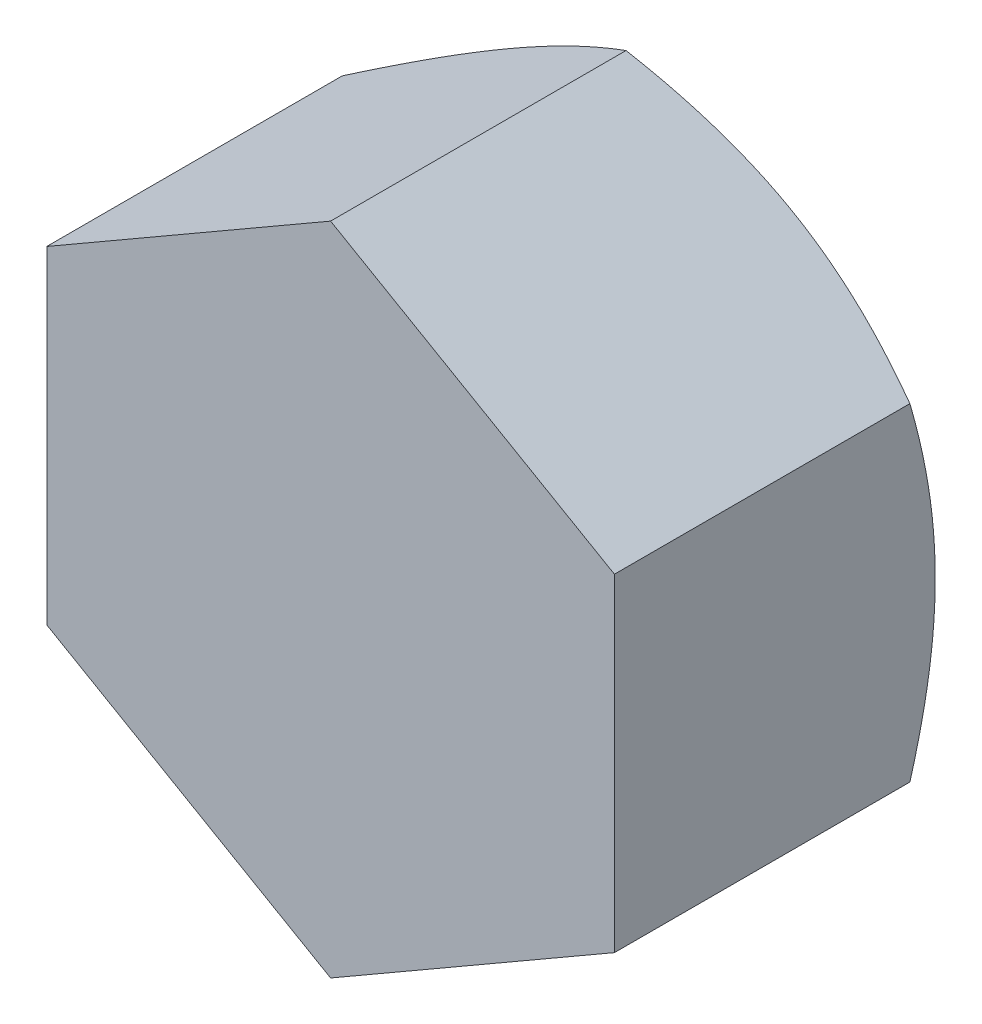
ISO-10303-21;
HEADER;
FILE_DESCRIPTION(('STEP AP214'),'2;1');
FILE_NAME('part.step','',(''),(''),'','','');
FILE_SCHEMA(('AUTOMOTIVE_DESIGN { 1 0 10303 214 1 1 1 1 }'));
ENDSEC;
DATA;
#1=APPLICATION_CONTEXT('core data for automotive mechanical design processes');
#2=APPLICATION_PROTOCOL_DEFINITION('international standard','automotive_design',2000,#1);
#3=PRODUCT_CONTEXT('',#1,'mechanical');
#4=PRODUCT('Part','Part','',(#3));
#5=PRODUCT_RELATED_PRODUCT_CATEGORY('part','',(#4));
#6=PRODUCT_DEFINITION_FORMATION('','',#4);
#7=PRODUCT_DEFINITION_CONTEXT('part definition',#1,'design');
#8=PRODUCT_DEFINITION('design','',#6,#7);
#9=PRODUCT_DEFINITION_SHAPE('','',#8);
#10=(LENGTH_UNIT() NAMED_UNIT(*) SI_UNIT(.MILLI.,.METRE.));
#11=(NAMED_UNIT(*) PLANE_ANGLE_UNIT() SI_UNIT($,.RADIAN.));
#12=(NAMED_UNIT(*) SI_UNIT($,.STERADIAN.) SOLID_ANGLE_UNIT());
#13=UNCERTAINTY_MEASURE_WITH_UNIT(LENGTH_MEASURE(1.E-05),#10,'distance_accuracy_value','');
#14=(GEOMETRIC_REPRESENTATION_CONTEXT(3) GLOBAL_UNCERTAINTY_ASSIGNED_CONTEXT((#13)) GLOBAL_UNIT_ASSIGNED_CONTEXT((#10,
#11,#12)) REPRESENTATION_CONTEXT('',''));
#15=CARTESIAN_POINT('',(0.,0.,0.));
#16=DIRECTION('',(0.,0.,1.));
#17=DIRECTION('',(1.,0.,0.));
#18=AXIS2_PLACEMENT_3D('',#15,#16,#17);
#19=CARTESIAN_POINT('',(0.,-28.8675134594813,30.));
#20=DIRECTION('',(-0.500000000000001,0.866025403784438,0.));
#21=DIRECTION('',(-0.866025403784438,-0.500000000000001,0.));
#22=AXIS2_PLACEMENT_3D('',#19,#20,#21);
#23=PLANE('',#22);
#24=DIRECTION('',(0.,0.,-1.));
#25=VECTOR('',#24,1.);
#26=CARTESIAN_POINT('',(0.,-28.8675134594813,30.));
#27=LINE('',#26,#25);
#28=CARTESIAN_POINT('',(0.,-28.8675134594813,30.));
#29=VERTEX_POINT('',#28);
#30=CARTESIAN_POINT('',(0.,-28.8675134594813,3.97632477146253));
#31=VERTEX_POINT('',#30);
#32=EDGE_CURVE('E120',#29,#31,#27,.T.);
#33=ORIENTED_EDGE('',*,*,#32,.T.);
#34=CARTESIAN_POINT('',(-0.000199999999998299,-28.8676289295351,3.97639143852919));
#35=CARTESIAN_POINT('',(0.549289052084762,-28.5503812773973,3.79324187699658));
#36=CARTESIAN_POINT('',(1.10092140397883,-28.2318961905375,3.61840342685477));
#37=CARTESIAN_POINT('',(2.20860953613433,-27.5923721492594,3.28765893053867));
#38=CARTESIAN_POINT('',(2.76466670754444,-27.2713323916609,3.13175911117848));
#39=CARTESIAN_POINT('',(3.88229099509689,-26.6260717083897,2.84098441971019));
#40=CARTESIAN_POINT('',(4.44386798066448,-26.3018450846015,2.70615975622985));
#41=CARTESIAN_POINT('',(5.57090024785688,-25.6511527017526,2.46043981125035));
#42=CARTESIAN_POINT('',(6.13635513733568,-25.3246871690974,2.34954214594442));
#43=CARTESIAN_POINT('',(7.25668973319835,-24.6778616885936,2.15638363698066));
#44=CARTESIAN_POINT('',(7.81148633888982,-24.3575497189522,2.07348401743573));
#45=CARTESIAN_POINT('',(8.92362166302868,-23.7154580901853,1.9344803387716));
#46=CARTESIAN_POINT('',(9.48096043020087,-23.3936784029286,1.8783767954414));
#47=CARTESIAN_POINT('',(10.5965741804021,-22.7495785039383,1.794381855324));
#48=CARTESIAN_POINT('',(11.1548472575887,-22.4272593925433,1.7664569345372));
#49=CARTESIAN_POINT('',(12.2719085883985,-21.7823237324989,1.73941975769827));
#50=CARTESIAN_POINT('',(12.8306968255687,-21.4597071933487,1.74030661129885));
#51=CARTESIAN_POINT('',(13.8753595301573,-20.8565708996421,1.76888055940881));
#52=CARTESIAN_POINT('',(14.3613084014292,-20.5760081880009,1.79308331308031));
#53=CARTESIAN_POINT('',(15.3320460032293,-20.0155525722891,1.86281959190132));
#54=CARTESIAN_POINT('',(15.8168347502745,-19.7356596586825,1.90835281152515));
#55=CARTESIAN_POINT('',(16.7850729894121,-19.1766470506767,2.01996088693692));
#56=CARTESIAN_POINT('',(17.2685208700197,-18.8975282866688,2.08605431780327));
#57=CARTESIAN_POINT('',(18.2331018020561,-18.3406272259024,2.23761307883569));
#58=CARTESIAN_POINT('',(18.7142348632835,-18.0628449234867,2.32307832692708));
#59=CARTESIAN_POINT('',(20.1748523165797,-17.219557043643,2.61072512631684));
#60=CARTESIAN_POINT('',(21.1501868444223,-16.6564473914432,2.84160387085608));
#61=CARTESIAN_POINT('',(22.6024175587137,-15.8180015976216,3.23466403779096));
#62=CARTESIAN_POINT('',(23.0842831517092,-15.5397963677924,3.37333299462311));
#63=CARTESIAN_POINT('',(24.044681348808,-14.9853102101682,3.6647094192832));
#64=CARTESIAN_POINT('',(24.5232148516457,-14.7090287634886,3.81741293035811));
#65=CARTESIAN_POINT('',(25.0002,-14.4336412596868,3.97639143852919));
#66=B_SPLINE_CURVE_WITH_KNOTS('',3,(#34,#35,#36,#37,#38,#39,#40,#41,#42,#43,#44,#45,#46,#47,#48,
#49,#50,#51,#52,#53,#54,#55,#56,#57,#58,#59,#60,#61,#62,#63,#64,#65),.UNSPECIFIED.,.F.,.F.,(4,2,
2,2,2,2,2,2,2,2,2,2,2,2,2,4),(0.,1.98125159104182,3.9631528428522,5.94970601011487,
7.93606116892722,9.87343019740899,11.8108365161782,13.7459351828953,15.6809740508569,
17.3655086515647,19.0500191246778,20.7360559068297,22.4220855456996,25.8684114168824,
27.588572489712,29.3082500776185),.UNSPECIFIED.);
#67=CARTESIAN_POINT('',(25.,-14.4337567297406,3.97632477146252));
#68=VERTEX_POINT('',#67);
#69=EDGE_CURVE('E61',#31,#68,#66,.T.);
#70=ORIENTED_EDGE('',*,*,#69,.T.);
#71=DIRECTION('',(0.,0.,-1.));
#72=VECTOR('',#71,1.);
#73=CARTESIAN_POINT('',(25.,-14.4337567297406,30.));
#74=LINE('',#73,#72);
#75=CARTESIAN_POINT('',(25.,-14.4337567297406,30.));
#76=VERTEX_POINT('',#75);
#77=EDGE_CURVE('E12',#76,#68,#74,.T.);
#78=ORIENTED_EDGE('',*,*,#77,.F.);
#79=DIRECTION('',(0.866025403784438,0.500000000000001,0.));
#80=VECTOR('',#79,1.);
#81=CARTESIAN_POINT('',(0.,-28.8675134594813,30.));
#82=LINE('',#81,#80);
#83=EDGE_CURVE('E152',#29,#76,#82,.T.);
#84=ORIENTED_EDGE('',*,*,#83,.F.);
#85=EDGE_LOOP('',(#33,#70,#78,#84));
#86=FACE_BOUND('',#85,.T.);
#87=ADVANCED_FACE('F44',(#86),#23,.F.);
#88=CARTESIAN_POINT('',(25.,-14.4337567297406,30.));
#89=DIRECTION('',(-1.,0.,0.));
#90=DIRECTION('',(0.,-1.,0.));
#91=AXIS2_PLACEMENT_3D('',#88,#89,#90);
#92=PLANE('',#91);
#93=ORIENTED_EDGE('',*,*,#77,.T.);
#94=CARTESIAN_POINT('',(25.,-43.5772807222665,16.3152862663971));
#95=CARTESIAN_POINT('',(25.,-43.0563685832066,16.0544210887609));
#96=CARTESIAN_POINT('',(25.,-42.5349954534363,15.7944768699678));
#97=CARTESIAN_POINT('',(25.,-41.4912415217681,15.2766137440135));
#98=CARTESIAN_POINT('',(25.,-40.9688607153084,15.0186948460477));
#99=CARTESIAN_POINT('',(25.,-39.4000205562734,14.2482229505251));
#100=CARTESIAN_POINT('',(25.,-38.3519279785103,13.7389871153385));
#101=CARTESIAN_POINT('',(25.,-36.2485085721749,12.7301929059742));
#102=CARTESIAN_POINT('',(25.,-35.1931714639728,12.2306559371404));
#103=CARTESIAN_POINT('',(25.,-33.076402903503,11.2446895295247));
#104=CARTESIAN_POINT('',(25.,-32.0149715701925,10.7582598359409));
#105=CARTESIAN_POINT('',(25.,-29.8366475594791,9.77990453187292));
#106=CARTESIAN_POINT('',(25.,-28.7194184767459,9.28872610629576));
#107=CARTESIAN_POINT('',(25.,-26.4753657408613,8.32851332741492));
#108=CARTESIAN_POINT('',(25.,-25.3485416626338,7.85947996126683));
#109=CARTESIAN_POINT('',(25.,-23.6501353206705,7.1772558183669));
#110=CARTESIAN_POINT('',(25.,-23.0828055460957,6.95346452143932));
#111=CARTESIAN_POINT('',(25.,-21.9450588595626,6.5138828392078));
#112=CARTESIAN_POINT('',(25.,-21.3746420001405,6.29809231823396));
#113=CARTESIAN_POINT('',(25.,-20.2305026548156,5.87557588818955));
#114=CARTESIAN_POINT('',(25.,-19.6567804188915,5.66884930355547));
#115=CARTESIAN_POINT('',(25.,-18.5057514380286,5.2656558207293));
#116=CARTESIAN_POINT('',(25.,-17.9284447734862,5.06918869334772));
#117=CARTESIAN_POINT('',(25.,-16.6355982782216,4.64362566721425));
#118=CARTESIAN_POINT('',(25.,-15.9190634092029,4.41753548937372));
#119=CARTESIAN_POINT('',(25.,-14.4798656651029,3.98587406236213));
#120=CARTESIAN_POINT('',(25.,-13.7572032124323,3.78030141107441));
#121=CARTESIAN_POINT('',(25.,-12.3054885670565,3.39288759828384));
#122=CARTESIAN_POINT('',(25.,-11.5764362181095,3.21104701880056));
#123=CARTESIAN_POINT('',(25.,-10.112034461392,2.87459913468423));
#124=CARTESIAN_POINT('',(25.,-9.37668508888708,2.71999167764019));
#125=CARTESIAN_POINT('',(25.,-7.91268916007062,2.44394934835832));
#126=CARTESIAN_POINT('',(25.,-7.18414126795437,2.32199507716184));
#127=CARTESIAN_POINT('',(25.,-5.72225840949767,2.11104924900467));
#128=CARTESIAN_POINT('',(25.,-4.98892352341115,2.02205714087051));
#129=CARTESIAN_POINT('',(25.,-3.51903424239963,1.87970742323896));
#130=CARTESIAN_POINT('',(25.,-2.78248109235317,1.8263370840782));
#131=CARTESIAN_POINT('',(25.,-1.30760523412593,1.75691535752753));
#132=CARTESIAN_POINT('',(25.,-0.569282537936912,1.74086371795046));
#133=CARTESIAN_POINT('',(25.,0.911819512644196,1.74664323567713));
#134=CARTESIAN_POINT('',(25.,1.65459794331451,1.768711284555));
#135=CARTESIAN_POINT('',(25.,3.13807045816364,1.85043061648652));
#136=CARTESIAN_POINT('',(25.,3.87876451915421,1.91008231600438));
#137=CARTESIAN_POINT('',(25.,5.35666308052783,2.06505740706202));
#138=CARTESIAN_POINT('',(25.,6.09386612840581,2.16039451664693));
#139=CARTESIAN_POINT('',(25.,7.56324162943187,2.38392011846666));
#140=CARTESIAN_POINT('',(25.,8.29541400308831,2.51210912858694));
#141=CARTESIAN_POINT('',(25.,9.76656769738784,2.80050187508001));
#142=CARTESIAN_POINT('',(25.,10.5054470304733,2.96122206746965));
#143=CARTESIAN_POINT('',(25.,11.9767903987303,3.30958699696976));
#144=CARTESIAN_POINT('',(25.,12.7092544000909,3.49723187589139));
#145=CARTESIAN_POINT('',(25.,14.1677140488721,3.89591247452221));
#146=CARTESIAN_POINT('',(25.,14.8937100018829,4.10694708275734));
#147=CARTESIAN_POINT('',(25.,16.3395540822867,4.54919616922907));
#148=CARTESIAN_POINT('',(25.,17.0594018053171,4.78041196371009));
#149=CARTESIAN_POINT('',(25.,18.3453860604897,5.21066532261206));
#150=CARTESIAN_POINT('',(25.,18.9125994331202,5.40650198242793));
#151=CARTESIAN_POINT('',(25.,20.0436051762973,5.80783154544797));
#152=CARTESIAN_POINT('',(25.,20.6073974792064,6.01332463887042));
#153=CARTESIAN_POINT('',(25.,22.2940718141099,6.64259926471909));
#154=CARTESIAN_POINT('',(25.,23.4121944587021,7.07915688498004));
#155=CARTESIAN_POINT('',(25.,25.6381923365789,7.97916873115717));
#156=CARTESIAN_POINT('',(25.,26.7460615749784,8.44263766549797));
#157=CARTESIAN_POINT('',(25.,28.9526582810025,9.39067085207376));
#158=CARTESIAN_POINT('',(25.,30.0513861086696,9.87523426875438));
#159=CARTESIAN_POINT('',(25.,32.1944539716365,10.8401545021526));
#160=CARTESIAN_POINT('',(25.,33.2391123123234,11.3198067307284));
#161=CARTESIAN_POINT('',(25.,35.3225683437274,12.2916995175831));
#162=CARTESIAN_POINT('',(25.,36.361365929678,12.7839403000295));
#163=CARTESIAN_POINT('',(25.,38.4321105016929,13.7778572882132));
#164=CARTESIAN_POINT('',(25.,39.464066501214,14.2795147410884));
#165=CARTESIAN_POINT('',(25.,41.0088115297687,15.0384015658447));
#166=CARTESIAN_POINT('',(25.,41.5231802591306,15.2924231984288));
#167=CARTESIAN_POINT('',(25.,42.5509419268147,15.8024276001523));
#168=CARTESIAN_POINT('',(25.,43.0643348693274,16.0584103608456));
#169=CARTESIAN_POINT('',(25.,43.5772807222665,16.3152862663971));
#170=B_SPLINE_CURVE_WITH_KNOTS('',3,(#94,#95,#96,#97,#98,#99,#100,#101,#102,#103,#104,#105,#106,
#107,#108,#109,#110,#111,#112,#113,#114,#115,#116,#117,#118,#119,#120,#121,#122,#123,#124,#125,
#126,#127,#128,#129,#130,#131,#132,#133,#134,#135,#136,#137,#138,#139,#140,#141,#142,#143,#144,
#145,#146,#147,#148,#149,#150,#151,#152,#153,#154,#155,#156,#157,#158,#159,#160,#161,#162,#163,
#164,#165,#166,#167,#168,#169),.UNSPECIFIED.,.F.,.F.,(4,2,2,2,2,2,2,2,2,2,2,2,2,2,2,2,2,2,2,2,2,
2,2,2,2,2,2,2,2,2,2,2,2,2,2,2,2,4),(0.,1.74773992342995,3.49548777741172,6.99120001058636,
10.4939076901573,13.9965472288587,17.6576702915162,21.3189564014892,23.1485279376223,
24.9780684353395,26.8074723390732,28.6368353576361,30.8906402614217,33.1442910401839,
35.3979970784483,37.6516905033783,39.8670593067691,42.0823910644223,44.2969307348576,
46.5114554401389,48.7397916800244,50.9681526125253,53.1973710440037,55.4266246195947,
57.6945224530806,59.9624322319243,62.2302342864351,64.4981843607649,66.298299352136,
68.0984498181395,71.6989306336591,75.3013981675158,78.9037231369097,82.3521600153743,
85.8006583438356,89.2428957988782,90.9639152835414,92.6849273601793),.UNSPECIFIED.);
#171=CARTESIAN_POINT('',(25.,14.4337567297407,3.97632477146253));
#172=VERTEX_POINT('',#171);
#173=EDGE_CURVE('E146',#68,#172,#170,.T.);
#174=ORIENTED_EDGE('',*,*,#173,.T.);
#175=DIRECTION('',(0.,0.,-1.));
#176=VECTOR('',#175,1.);
#177=CARTESIAN_POINT('',(25.,14.4337567297407,30.));
#178=LINE('',#177,#176);
#179=CARTESIAN_POINT('',(25.,14.4337567297407,30.));
#180=VERTEX_POINT('',#179);
#181=EDGE_CURVE('E54',#180,#172,#178,.T.);
#182=ORIENTED_EDGE('',*,*,#181,.F.);
#183=DIRECTION('',(0.,1.,0.));
#184=VECTOR('',#183,1.);
#185=CARTESIAN_POINT('',(25.,-14.4337567297406,30.));
#186=LINE('',#185,#184);
#187=EDGE_CURVE('E145',#76,#180,#186,.T.);
#188=ORIENTED_EDGE('',*,*,#187,.F.);
#189=EDGE_LOOP('',(#93,#174,#182,#188));
#190=FACE_BOUND('',#189,.T.);
#191=ADVANCED_FACE('F144',(#190),#92,.F.);
#192=CARTESIAN_POINT('',(25.,14.4337567297407,30.));
#193=DIRECTION('',(-0.5,-0.866025403784439,0.));
#194=DIRECTION('',(0.866025403784439,-0.5,0.));
#195=AXIS2_PLACEMENT_3D('',#192,#193,#194);
#196=PLANE('',#195);
#197=ORIENTED_EDGE('',*,*,#181,.T.);
#198=CARTESIAN_POINT('',(25.0002,14.4336412596868,3.9763914385292));
#199=CARTESIAN_POINT('',(24.4507109479152,14.7508889118247,3.79324187699658));
#200=CARTESIAN_POINT('',(23.8990785960212,15.0693739986845,3.61840342685477));
#201=CARTESIAN_POINT('',(22.7913904638657,15.7088980399626,3.28765893053867));
#202=CARTESIAN_POINT('',(22.2353332924556,16.0299377975611,3.13175911117848));
#203=CARTESIAN_POINT('',(21.1177090049031,16.6751984808323,2.84098441971019));
#204=CARTESIAN_POINT('',(20.5561320193355,16.9994251046205,2.70615975622985));
#205=CARTESIAN_POINT('',(19.4290997521431,17.6501174874694,2.46043981125035));
#206=CARTESIAN_POINT('',(18.8636448626643,17.9765830201246,2.34954214594442));
#207=CARTESIAN_POINT('',(17.7433102668017,18.6234085006283,2.15638363698067));
#208=CARTESIAN_POINT('',(17.1885136611102,18.9437204702698,2.07348401743574));
#209=CARTESIAN_POINT('',(16.0763783369713,19.5858120990367,1.9344803387716));
#210=CARTESIAN_POINT('',(15.5190395697991,19.9075917862933,1.8783767954414));
#211=CARTESIAN_POINT('',(14.4034258195979,20.5516916852837,1.79438185532401));
#212=CARTESIAN_POINT('',(13.8451527424113,20.8740107966786,1.7664569345372));
#213=CARTESIAN_POINT('',(12.7280914116014,21.5189464567231,1.73941975769828));
#214=CARTESIAN_POINT('',(12.1693031744313,21.8415629958732,1.74030661129885));
#215=CARTESIAN_POINT('',(11.1246404698427,22.4446992895798,1.76888055940882));
#216=CARTESIAN_POINT('',(10.6386915985708,22.7252620012211,1.79308331308032));
#217=CARTESIAN_POINT('',(9.66795399677066,23.2857176169329,1.86281959190133));
#218=CARTESIAN_POINT('',(9.18316524972546,23.5656105305395,1.90835281152516));
#219=CARTESIAN_POINT('',(8.21492701058794,24.1246231385452,2.01996088693693));
#220=CARTESIAN_POINT('',(7.73147912998032,24.4037419025532,2.08605431780328));
#221=CARTESIAN_POINT('',(6.76689819794391,24.9606429633196,2.23761307883571));
#222=CARTESIAN_POINT('',(6.28576513671649,25.2384252657353,2.32307832692709));
#223=CARTESIAN_POINT('',(4.82514768342029,26.0817131455789,2.61072512631686));
#224=CARTESIAN_POINT('',(3.84981315557772,26.6448227977788,2.84160387085609));
#225=CARTESIAN_POINT('',(2.3975824412863,27.4832685916003,3.23466403779096));
#226=CARTESIAN_POINT('',(1.91571684829083,27.7614738214295,3.37333299462312));
#227=CARTESIAN_POINT('',(0.955318651191971,28.3159599790538,3.66470941928322));
#228=CARTESIAN_POINT('',(0.476785148354278,28.5922414257333,3.81741293035812));
#229=CARTESIAN_POINT('',(-0.000200000000000546,28.8676289295351,3.9763914385292));
#230=B_SPLINE_CURVE_WITH_KNOTS('',3,(#198,#199,#200,#201,#202,#203,#204,#205,#206,#207,#208,
#209,#210,#211,#212,#213,#214,#215,#216,#217,#218,#219,#220,#221,#222,#223,#224,#225,#226,#227,
#228,#229),.UNSPECIFIED.,.F.,.F.,(4,2,2,2,2,2,2,2,2,2,2,2,2,2,2,4),(0.,1.98125159104182,
3.9631528428522,5.94970601011487,7.93606116892722,9.87343019740899,11.8108365161782,
13.7459351828953,15.6809740508569,17.3655086515647,19.0500191246777,20.7360559068297,
22.4220855456996,25.8684114168823,27.5885724897119,29.3082500776184),.UNSPECIFIED.);
#231=CARTESIAN_POINT('',(0.,28.8675134594813,3.97632477146253));
#232=VERTEX_POINT('',#231);
#233=EDGE_CURVE('E140',#172,#232,#230,.T.);
#234=ORIENTED_EDGE('',*,*,#233,.T.);
#235=DIRECTION('',(0.,0.,-1.));
#236=VECTOR('',#235,1.);
#237=CARTESIAN_POINT('',(0.,28.8675134594813,30.));
#238=LINE('',#237,#236);
#239=CARTESIAN_POINT('',(0.,28.8675134594813,30.));
#240=VERTEX_POINT('',#239);
#241=EDGE_CURVE('E124',#240,#232,#238,.T.);
#242=ORIENTED_EDGE('',*,*,#241,.F.);
#243=DIRECTION('',(-0.866025403784439,0.5,0.));
#244=VECTOR('',#243,1.);
#245=CARTESIAN_POINT('',(25.,14.4337567297407,30.));
#246=LINE('',#245,#244);
#247=EDGE_CURVE('E141',#180,#240,#246,.T.);
#248=ORIENTED_EDGE('',*,*,#247,.F.);
#249=EDGE_LOOP('',(#197,#234,#242,#248));
#250=FACE_BOUND('',#249,.T.);
#251=ADVANCED_FACE('F138',(#250),#196,.F.);
#252=CARTESIAN_POINT('',(0.,28.8675134594813,30.));
#253=DIRECTION('',(0.5,-0.866025403784438,0.));
#254=DIRECTION('',(0.866025403784438,0.5,0.));
#255=AXIS2_PLACEMENT_3D('',#252,#253,#254);
#256=PLANE('',#255);
#257=ORIENTED_EDGE('',*,*,#241,.T.);
#258=CARTESIAN_POINT('',(0.000199999999999174,28.8676289295351,3.9763914385292));
#259=CARTESIAN_POINT('',(-0.549289052084762,28.5503812773973,3.79324187699659));
#260=CARTESIAN_POINT('',(-1.10092140397883,28.2318961905375,3.61840342685477));
#261=CARTESIAN_POINT('',(-2.20860953613432,27.5923721492594,3.28765893053868));
#262=CARTESIAN_POINT('',(-2.76466670754444,27.2713323916609,3.13175911117849));
#263=CARTESIAN_POINT('',(-3.88229099509689,26.6260717083897,2.84098441971019));
#264=CARTESIAN_POINT('',(-4.44386798066448,26.3018450846015,2.70615975622985));
#265=CARTESIAN_POINT('',(-5.57090024785688,25.6511527017526,2.46043981125035));
#266=CARTESIAN_POINT('',(-6.13635513733568,25.3246871690974,2.34954214594442));
#267=CARTESIAN_POINT('',(-7.25668973319835,24.6778616885936,2.15638363698066));
#268=CARTESIAN_POINT('',(-7.81148633888982,24.3575497189522,2.07348401743574));
#269=CARTESIAN_POINT('',(-8.92362166302868,23.7154580901853,1.9344803387716));
#270=CARTESIAN_POINT('',(-9.48096043020088,23.3936784029286,1.8783767954414));
#271=CARTESIAN_POINT('',(-10.5965741804021,22.7495785039383,1.794381855324));
#272=CARTESIAN_POINT('',(-11.1548472575887,22.4272593925433,1.7664569345372));
#273=CARTESIAN_POINT('',(-12.2719085883985,21.7823237324989,1.73941975769828));
#274=CARTESIAN_POINT('',(-12.8306968255687,21.4597071933487,1.74030661129885));
#275=CARTESIAN_POINT('',(-13.8753595301573,20.8565708996422,1.76888055940881));
#276=CARTESIAN_POINT('',(-14.3613084014292,20.5760081880009,1.79308331308032));
#277=CARTESIAN_POINT('',(-15.3320460032293,20.0155525722891,1.86281959190132));
#278=CARTESIAN_POINT('',(-15.8168347502745,19.7356596586825,1.90835281152515));
#279=CARTESIAN_POINT('',(-16.7850729894121,19.1766470506767,2.01996088693693));
#280=CARTESIAN_POINT('',(-17.2685208700197,18.8975282866688,2.08605431780327));
#281=CARTESIAN_POINT('',(-18.2331018020561,18.3406272259024,2.2376130788357));
#282=CARTESIAN_POINT('',(-18.7142348632835,18.0628449234867,2.32307832692709));
#283=CARTESIAN_POINT('',(-20.1748523165797,17.2195570436431,2.61072512631685));
#284=CARTESIAN_POINT('',(-21.1501868444223,16.6564473914432,2.84160387085608));
#285=CARTESIAN_POINT('',(-22.6024175587137,15.8180015976216,3.23466403779096));
#286=CARTESIAN_POINT('',(-23.0842831517092,15.5397963677925,3.37333299462312));
#287=CARTESIAN_POINT('',(-24.044681348808,14.9853102101682,3.66470941928321));
#288=CARTESIAN_POINT('',(-24.5232148516457,14.7090287634886,3.81741293035812));
#289=CARTESIAN_POINT('',(-25.0002,14.4336412596868,3.97639143852919));
#290=B_SPLINE_CURVE_WITH_KNOTS('',3,(#258,#259,#260,#261,#262,#263,#264,#265,#266,#267,#268,
#269,#270,#271,#272,#273,#274,#275,#276,#277,#278,#279,#280,#281,#282,#283,#284,#285,#286,#287,
#288,#289),.UNSPECIFIED.,.F.,.F.,(4,2,2,2,2,2,2,2,2,2,2,2,2,2,2,4),(0.,1.98125159104182,
3.96315284285219,5.94970601011487,7.93606116892722,9.873430197409,11.8108365161782,
13.7459351828953,15.6809740508569,17.3655086515647,19.0500191246777,20.7360559068297,
22.4220855456996,25.8684114168824,27.588572489712,29.3082500776185),.UNSPECIFIED.);
#291=CARTESIAN_POINT('',(-25.,14.4337567297406,3.97632477146253));
#292=VERTEX_POINT('',#291);
#293=EDGE_CURVE('E116',#232,#292,#290,.T.);
#294=ORIENTED_EDGE('',*,*,#293,.T.);
#295=DIRECTION('',(0.,0.,-1.));
#296=VECTOR('',#295,1.);
#297=CARTESIAN_POINT('',(-25.,14.4337567297406,30.));
#298=LINE('',#297,#296);
#299=CARTESIAN_POINT('',(-25.,14.4337567297406,30.));
#300=VERTEX_POINT('',#299);
#301=EDGE_CURVE('E114',#300,#292,#298,.T.);
#302=ORIENTED_EDGE('',*,*,#301,.F.);
#303=DIRECTION('',(-0.866025403784438,-0.5,0.));
#304=VECTOR('',#303,1.);
#305=CARTESIAN_POINT('',(0.,28.8675134594813,30.));
#306=LINE('',#305,#304);
#307=EDGE_CURVE('E221',#240,#300,#306,.T.);
#308=ORIENTED_EDGE('',*,*,#307,.F.);
#309=EDGE_LOOP('',(#257,#294,#302,#308));
#310=FACE_BOUND('',#309,.T.);
#311=ADVANCED_FACE('F200',(#310),#256,.F.);
#312=CARTESIAN_POINT('',(-25.,14.4337567297406,30.));
#313=DIRECTION('',(1.,0.,0.));
#314=DIRECTION('',(0.,1.,0.));
#315=AXIS2_PLACEMENT_3D('',#312,#313,#314);
#316=PLANE('',#315);
#317=ORIENTED_EDGE('',*,*,#301,.T.);
#318=CARTESIAN_POINT('',(-25.,43.5772807222665,16.3152862663971));
#319=CARTESIAN_POINT('',(-25.,43.0563685832066,16.0544210887609));
#320=CARTESIAN_POINT('',(-25.,42.5349954534363,15.7944768699678));
#321=CARTESIAN_POINT('',(-25.,41.4912415217681,15.2766137440135));
#322=CARTESIAN_POINT('',(-25.,40.9688607153084,15.0186948460477));
#323=CARTESIAN_POINT('',(-25.,39.4000205562734,14.2482229505251));
#324=CARTESIAN_POINT('',(-25.,38.3519279785103,13.7389871153385));
#325=CARTESIAN_POINT('',(-25.,36.2485085721749,12.7301929059742));
#326=CARTESIAN_POINT('',(-25.,35.1931714639728,12.2306559371404));
#327=CARTESIAN_POINT('',(-25.,33.076402903503,11.2446895295247));
#328=CARTESIAN_POINT('',(-25.,32.0149715701925,10.7582598359409));
#329=CARTESIAN_POINT('',(-25.,29.8366475594791,9.77990453187292));
#330=CARTESIAN_POINT('',(-25.,28.7194184767459,9.28872610629576));
#331=CARTESIAN_POINT('',(-25.,26.4753657408613,8.32851332741492));
#332=CARTESIAN_POINT('',(-25.,25.3485416626338,7.85947996126683));
#333=CARTESIAN_POINT('',(-25.,23.6501353206705,7.1772558183669));
#334=CARTESIAN_POINT('',(-25.,23.0828055460957,6.95346452143932));
#335=CARTESIAN_POINT('',(-25.,21.9450588595626,6.5138828392078));
#336=CARTESIAN_POINT('',(-25.,21.3746420001405,6.29809231823396));
#337=CARTESIAN_POINT('',(-25.,20.2305026548156,5.87557588818955));
#338=CARTESIAN_POINT('',(-25.,19.6567804188915,5.66884930355548));
#339=CARTESIAN_POINT('',(-25.,18.5057514380286,5.2656558207293));
#340=CARTESIAN_POINT('',(-25.,17.9284447734862,5.06918869334772));
#341=CARTESIAN_POINT('',(-25.,16.6355982782216,4.64362566721425));
#342=CARTESIAN_POINT('',(-25.,15.9190634092029,4.41753548937372));
#343=CARTESIAN_POINT('',(-25.,14.4798656651029,3.98587406236214));
#344=CARTESIAN_POINT('',(-25.,13.7572032124323,3.78030141107441));
#345=CARTESIAN_POINT('',(-25.,12.3054885670565,3.39288759828385));
#346=CARTESIAN_POINT('',(-25.,11.5764362181095,3.21104701880057));
#347=CARTESIAN_POINT('',(-25.,10.112034461392,2.87459913468424));
#348=CARTESIAN_POINT('',(-25.,9.37668508888707,2.7199916776402));
#349=CARTESIAN_POINT('',(-25.,7.91268916007061,2.44394934835833));
#350=CARTESIAN_POINT('',(-25.,7.18414126795436,2.32199507716185));
#351=CARTESIAN_POINT('',(-25.,5.72225840949767,2.11104924900468));
#352=CARTESIAN_POINT('',(-25.,4.98892352341114,2.02205714087052));
#353=CARTESIAN_POINT('',(-25.,3.51903424239963,1.87970742323896));
#354=CARTESIAN_POINT('',(-25.,2.78248109235316,1.8263370840782));
#355=CARTESIAN_POINT('',(-25.,1.30760523412593,1.75691535752753));
#356=CARTESIAN_POINT('',(-25.,0.569282537936905,1.74086371795046));
#357=CARTESIAN_POINT('',(-25.,-0.9118195126442,1.74664323567713));
#358=CARTESIAN_POINT('',(-25.,-1.65459794331451,1.76871128455501));
#359=CARTESIAN_POINT('',(-25.,-3.13807045816364,1.85043061648652));
#360=CARTESIAN_POINT('',(-25.,-3.87876451915422,1.91008231600438));
#361=CARTESIAN_POINT('',(-25.,-5.35666308052784,2.06505740706202));
#362=CARTESIAN_POINT('',(-25.,-6.09386612840582,2.16039451664694));
#363=CARTESIAN_POINT('',(-25.,-7.56324162943188,2.38392011846666));
#364=CARTESIAN_POINT('',(-25.,-8.29541400308832,2.51210912858695));
#365=CARTESIAN_POINT('',(-25.,-9.76656769738785,2.80050187508002));
#366=CARTESIAN_POINT('',(-25.,-10.5054470304733,2.96122206746965));
#367=CARTESIAN_POINT('',(-25.,-11.9767903987303,3.30958699696977));
#368=CARTESIAN_POINT('',(-25.,-12.7092544000909,3.4972318758914));
#369=CARTESIAN_POINT('',(-25.,-14.1677140488721,3.89591247452222));
#370=CARTESIAN_POINT('',(-25.,-14.8937100018829,4.10694708275735));
#371=CARTESIAN_POINT('',(-25.,-16.3395540822867,4.54919616922908));
#372=CARTESIAN_POINT('',(-25.,-17.0594018053171,4.7804119637101));
#373=CARTESIAN_POINT('',(-25.,-18.3453860604897,5.21066532261207));
#374=CARTESIAN_POINT('',(-25.,-18.9125994331202,5.40650198242794));
#375=CARTESIAN_POINT('',(-25.,-20.0436051762973,5.80783154544799));
#376=CARTESIAN_POINT('',(-25.,-20.6073974792064,6.01332463887043));
#377=CARTESIAN_POINT('',(-25.,-22.29407181411,6.64259926471911));
#378=CARTESIAN_POINT('',(-25.,-23.4121944587021,7.07915688498005));
#379=CARTESIAN_POINT('',(-25.,-25.6381923365789,7.97916873115718));
#380=CARTESIAN_POINT('',(-25.,-26.7460615749784,8.44263766549798));
#381=CARTESIAN_POINT('',(-25.,-28.9526582810025,9.39067085207376));
#382=CARTESIAN_POINT('',(-25.,-30.0513861086696,9.87523426875439));
#383=CARTESIAN_POINT('',(-25.,-32.1944539716365,10.8401545021526));
#384=CARTESIAN_POINT('',(-25.,-33.2391123123234,11.3198067307284));
#385=CARTESIAN_POINT('',(-25.,-35.3225683437274,12.2916995175831));
#386=CARTESIAN_POINT('',(-25.,-36.361365929678,12.7839403000295));
#387=CARTESIAN_POINT('',(-25.,-38.4321105016929,13.7778572882132));
#388=CARTESIAN_POINT('',(-25.,-39.464066501214,14.2795147410884));
#389=CARTESIAN_POINT('',(-25.,-41.0088115297687,15.0384015658447));
#390=CARTESIAN_POINT('',(-25.,-41.5231802591306,15.2924231984287));
#391=CARTESIAN_POINT('',(-25.,-42.5509419268146,15.8024276001523));
#392=CARTESIAN_POINT('',(-25.,-43.0643348693274,16.0584103608456));
#393=CARTESIAN_POINT('',(-25.,-43.5772807222665,16.3152862663971));
#394=B_SPLINE_CURVE_WITH_KNOTS('',3,(#318,#319,#320,#321,#322,#323,#324,#325,#326,#327,#328,
#329,#330,#331,#332,#333,#334,#335,#336,#337,#338,#339,#340,#341,#342,#343,#344,#345,#346,#347,
#348,#349,#350,#351,#352,#353,#354,#355,#356,#357,#358,#359,#360,#361,#362,#363,#364,#365,#366,
#367,#368,#369,#370,#371,#372,#373,#374,#375,#376,#377,#378,#379,#380,#381,#382,#383,#384,#385,
#386,#387,#388,#389,#390,#391,#392,#393),.UNSPECIFIED.,.F.,.F.,(4,2,2,2,2,2,2,2,2,2,2,2,2,2,2,2,
2,2,2,2,2,2,2,2,2,2,2,2,2,2,2,2,2,2,2,2,2,4),(0.,1.74773992342996,3.49548777741172,
6.99120001058637,10.4939076901573,13.9965472288587,17.6576702915162,21.3189564014893,
23.1485279376223,24.9780684353395,26.8074723390732,28.6368353576361,30.8906402614217,
33.1442910401839,35.3979970784483,37.6516905033783,39.8670593067691,42.0823910644223,
44.2969307348576,46.5114554401389,48.7397916800244,50.9681526125253,53.1973710440037,
55.4266246195947,57.6945224530806,59.9624322319243,62.2302342864351,64.4981843607649,
66.298299352136,68.0984498181395,71.6989306336591,75.3013981675158,78.9037231369097,
82.3521600153743,85.8006583438356,89.2428957988782,90.9639152835414,92.6849273601793),.UNSPECIFIED.);
#395=CARTESIAN_POINT('',(-25.,-14.4337567297407,3.97632477146253));
#396=VERTEX_POINT('',#395);
#397=EDGE_CURVE('E100',#292,#396,#394,.T.);
#398=ORIENTED_EDGE('',*,*,#397,.T.);
#399=DIRECTION('',(0.,0.,-1.));
#400=VECTOR('',#399,1.);
#401=CARTESIAN_POINT('',(-25.,-14.4337567297407,30.));
#402=LINE('',#401,#400);
#403=CARTESIAN_POINT('',(-25.,-14.4337567297407,30.));
#404=VERTEX_POINT('',#403);
#405=EDGE_CURVE('E112',#404,#396,#402,.T.);
#406=ORIENTED_EDGE('',*,*,#405,.F.);
#407=DIRECTION('',(0.,-1.,0.));
#408=VECTOR('',#407,1.);
#409=CARTESIAN_POINT('',(-25.,14.4337567297406,30.));
#410=LINE('',#409,#408);
#411=EDGE_CURVE('E224',#300,#404,#410,.T.);
#412=ORIENTED_EDGE('',*,*,#411,.F.);
#413=EDGE_LOOP('',(#317,#398,#406,#412));
#414=FACE_BOUND('',#413,.T.);
#415=ADVANCED_FACE('F110',(#414),#316,.F.);
#416=CARTESIAN_POINT('',(-25.,-14.4337567297407,30.));
#417=DIRECTION('',(0.5,0.866025403784439,0.));
#418=DIRECTION('',(-0.866025403784439,0.5,0.));
#419=AXIS2_PLACEMENT_3D('',#416,#417,#418);
#420=PLANE('',#419);
#421=ORIENTED_EDGE('',*,*,#405,.T.);
#422=CARTESIAN_POINT('',(-25.0002,-14.4336412596868,3.97639143852919));
#423=CARTESIAN_POINT('',(-24.4507109479153,-14.7508889118247,3.79324187699658));
#424=CARTESIAN_POINT('',(-23.8990785960212,-15.0693739986845,3.61840342685477));
#425=CARTESIAN_POINT('',(-22.7913904638657,-15.7088980399626,3.28765893053867));
#426=CARTESIAN_POINT('',(-22.2353332924556,-16.029937797561,3.13175911117848));
#427=CARTESIAN_POINT('',(-21.1177090049031,-16.6751984808323,2.84098441971019));
#428=CARTESIAN_POINT('',(-20.5561320193355,-16.9994251046205,2.70615975622985));
#429=CARTESIAN_POINT('',(-19.4290997521431,-17.6501174874694,2.46043981125035));
#430=CARTESIAN_POINT('',(-18.8636448626643,-17.9765830201246,2.34954214594442));
#431=CARTESIAN_POINT('',(-17.7433102668017,-18.6234085006283,2.15638363698066));
#432=CARTESIAN_POINT('',(-17.1885136611102,-18.9437204702698,2.07348401743574));
#433=CARTESIAN_POINT('',(-16.0763783369713,-19.5858120990366,1.9344803387716));
#434=CARTESIAN_POINT('',(-15.5190395697991,-19.9075917862933,1.8783767954414));
#435=CARTESIAN_POINT('',(-14.4034258195979,-20.5516916852837,1.79438185532401));
#436=CARTESIAN_POINT('',(-13.8451527424113,-20.8740107966786,1.7664569345372));
#437=CARTESIAN_POINT('',(-12.7280914116015,-21.518946456723,1.73941975769828));
#438=CARTESIAN_POINT('',(-12.1693031744313,-21.8415629958732,1.74030661129885));
#439=CARTESIAN_POINT('',(-11.1246404698427,-22.4446992895798,1.76888055940881));
#440=CARTESIAN_POINT('',(-10.6386915985708,-22.7252620012211,1.79308331308032));
#441=CARTESIAN_POINT('',(-9.66795399677066,-23.2857176169328,1.86281959190133));
#442=CARTESIAN_POINT('',(-9.18316524972547,-23.5656105305395,1.90835281152515));
#443=CARTESIAN_POINT('',(-8.21492701058794,-24.1246231385452,2.01996088693693));
#444=CARTESIAN_POINT('',(-7.73147912998033,-24.4037419025532,2.08605431780328));
#445=CARTESIAN_POINT('',(-6.76689819794392,-24.9606429633196,2.2376130788357));
#446=CARTESIAN_POINT('',(-6.28576513671649,-25.2384252657353,2.32307832692709));
#447=CARTESIAN_POINT('',(-4.8251476834203,-26.0817131455789,2.61072512631685));
#448=CARTESIAN_POINT('',(-3.84981315557773,-26.6448227977787,2.84160387085609));
#449=CARTESIAN_POINT('',(-2.3975824412863,-27.4832685916003,3.23466403779096));
#450=CARTESIAN_POINT('',(-1.91571684829083,-27.7614738214295,3.37333299462312));
#451=CARTESIAN_POINT('',(-0.95531865119197,-28.3159599790537,3.66470941928321));
#452=CARTESIAN_POINT('',(-0.476785148354276,-28.5922414257333,3.81741293035812));
#453=CARTESIAN_POINT('',(0.000200000000002556,-28.8676289295351,3.9763914385292));
#454=B_SPLINE_CURVE_WITH_KNOTS('',3,(#422,#423,#424,#425,#426,#427,#428,#429,#430,#431,#432,
#433,#434,#435,#436,#437,#438,#439,#440,#441,#442,#443,#444,#445,#446,#447,#448,#449,#450,#451,
#452,#453),.UNSPECIFIED.,.F.,.F.,(4,2,2,2,2,2,2,2,2,2,2,2,2,2,2,4),(0.,1.98125159104182,
3.96315284285219,5.94970601011487,7.93606116892722,9.873430197409,11.8108365161782,
13.7459351828953,15.6809740508569,17.3655086515647,19.0500191246777,20.7360559068297,
22.4220855456996,25.8684114168824,27.588572489712,29.3082500776185),.UNSPECIFIED.);
#455=EDGE_CURVE('E97',#396,#31,#454,.T.);
#456=ORIENTED_EDGE('',*,*,#455,.T.);
#457=ORIENTED_EDGE('',*,*,#32,.F.);
#458=DIRECTION('',(0.866025403784439,-0.5,0.));
#459=VECTOR('',#458,1.);
#460=CARTESIAN_POINT('',(-25.,-14.4337567297407,30.));
#461=LINE('',#460,#459);
#462=EDGE_CURVE('E69',#404,#29,#461,.T.);
#463=ORIENTED_EDGE('',*,*,#462,.F.);
#464=EDGE_LOOP('',(#421,#456,#457,#463));
#465=FACE_BOUND('',#464,.T.);
#466=ADVANCED_FACE('F118',(#465),#420,.F.);
#467=CARTESIAN_POINT('',(0.,0.,30.));
#468=DIRECTION('',(0.,0.,1.));
#469=DIRECTION('',(1.,0.,0.));
#470=AXIS2_PLACEMENT_3D('',#467,#468,#469);
#471=PLANE('',#470);
#472=ORIENTED_EDGE('',*,*,#83,.T.);
#473=ORIENTED_EDGE('',*,*,#187,.T.);
#474=ORIENTED_EDGE('',*,*,#247,.T.);
#475=ORIENTED_EDGE('',*,*,#307,.T.);
#476=ORIENTED_EDGE('',*,*,#411,.T.);
#477=ORIENTED_EDGE('',*,*,#462,.T.);
#478=EDGE_LOOP('',(#472,#473,#474,#475,#476,#477));
#479=FACE_BOUND('',#478,.T.);
#480=ADVANCED_FACE('F176',(#479),#471,.T.);
#481=CARTESIAN_POINT('',(0.,0.,4.));
#482=DIRECTION('',(0.,0.,1.));
#483=DIRECTION('',(1.,0.,0.));
#484=AXIS2_PLACEMENT_3D('',#481,#482,#483);
#485=CONICAL_SURFACE('',#484,28.908520158189,1.0471975511966);
#486=CARTESIAN_POINT('',(0.,0.,0.));
#487=DIRECTION('',(0.,0.,1.));
#488=DIRECTION('',(1.,0.,0.));
#489=AXIS2_PLACEMENT_3D('',#486,#487,#488);
#490=CIRCLE('',#489,21.9803169279135);
#491=CARTESIAN_POINT('',(21.9803169279135,0.,0.));
#492=VERTEX_POINT('',#491);
#493=EDGE_CURVE('E48',#492,#492,#490,.F.);
#494=ORIENTED_EDGE('',*,*,#493,.F.);
#495=EDGE_LOOP('',(#494));
#496=FACE_BOUND('',#495,.T.);
#497=ORIENTED_EDGE('',*,*,#455,.F.);
#498=ORIENTED_EDGE('',*,*,#397,.F.);
#499=ORIENTED_EDGE('',*,*,#293,.F.);
#500=ORIENTED_EDGE('',*,*,#233,.F.);
#501=ORIENTED_EDGE('',*,*,#173,.F.);
#502=ORIENTED_EDGE('',*,*,#69,.F.);
#503=EDGE_LOOP('',(#497,#498,#499,#500,#501,#502));
#504=FACE_BOUND('',#503,.T.);
#505=ADVANCED_FACE('F99',(#496,#504),#485,.T.);
#506=CARTESIAN_POINT('',(0.,0.,0.));
#507=DIRECTION('',(0.,0.,1.));
#508=DIRECTION('',(1.,0.,0.));
#509=AXIS2_PLACEMENT_3D('',#506,#507,#508);
#510=PLANE('',#509);
#511=ORIENTED_EDGE('',*,*,#493,.T.);
#512=EDGE_LOOP('',(#511));
#513=FACE_BOUND('',#512,.T.);
#514=ADVANCED_FACE('F175',(#513),#510,.F.);
#515=CLOSED_SHELL('',(#87,#191,#251,#311,#415,#466,#480,#505,#514));
#516=MANIFOLD_SOLID_BREP('B2',#515);
#517=ADVANCED_BREP_SHAPE_REPRESENTATION('',(#18,#516),#14);
#518=SHAPE_DEFINITION_REPRESENTATION(#9,#517);
ENDSEC;
END-ISO-10303-21;
